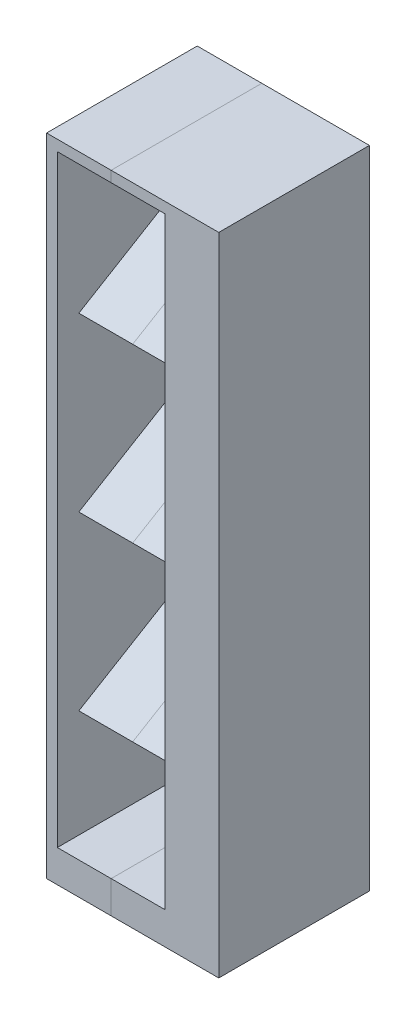
ISO-10303-21;
HEADER;
FILE_DESCRIPTION(('STEP AP214'),'2;1');
FILE_NAME('part.step','',(''),(''),'','','');
FILE_SCHEMA(('AUTOMOTIVE_DESIGN { 1 0 10303 214 1 1 1 1 }'));
ENDSEC;
DATA;
#1=APPLICATION_CONTEXT('core data for automotive mechanical design processes');
#2=APPLICATION_PROTOCOL_DEFINITION('international standard','automotive_design',2000,#1);
#3=PRODUCT_CONTEXT('',#1,'mechanical');
#4=PRODUCT('Part','Part','',(#3));
#5=PRODUCT_RELATED_PRODUCT_CATEGORY('part','',(#4));
#6=PRODUCT_DEFINITION_FORMATION('','',#4);
#7=PRODUCT_DEFINITION_CONTEXT('part definition',#1,'design');
#8=PRODUCT_DEFINITION('design','',#6,#7);
#9=PRODUCT_DEFINITION_SHAPE('','',#8);
#10=(LENGTH_UNIT() NAMED_UNIT(*) SI_UNIT(.MILLI.,.METRE.));
#11=(NAMED_UNIT(*) PLANE_ANGLE_UNIT() SI_UNIT($,.RADIAN.));
#12=(NAMED_UNIT(*) SI_UNIT($,.STERADIAN.) SOLID_ANGLE_UNIT());
#13=UNCERTAINTY_MEASURE_WITH_UNIT(LENGTH_MEASURE(1.E-05),#10,'distance_accuracy_value','');
#14=(GEOMETRIC_REPRESENTATION_CONTEXT(3) GLOBAL_UNCERTAINTY_ASSIGNED_CONTEXT((#13)) GLOBAL_UNIT_ASSIGNED_CONTEXT((#10,
#11,#12)) REPRESENTATION_CONTEXT('',''));
#15=CARTESIAN_POINT('',(0.,0.,0.));
#16=DIRECTION('',(0.,0.,1.));
#17=DIRECTION('',(1.,0.,0.));
#18=AXIS2_PLACEMENT_3D('',#15,#16,#17);
#19=CARTESIAN_POINT('',(-5.99706744868036,0.,0.));
#20=DIRECTION('',(1.,0.,0.));
#21=DIRECTION('',(0.,0.,-1.));
#22=AXIS2_PLACEMENT_3D('',#19,#20,#21);
#23=PLANE('',#22);
#24=DIRECTION('',(0.,-1.,0.));
#25=VECTOR('',#24,1.);
#26=CARTESIAN_POINT('',(-5.99706744868036,150.,24.633431085044));
#27=LINE('',#26,#25);
#28=CARTESIAN_POINT('',(-5.99706744868036,7.50000000000016,24.633431085044));
#29=VERTEX_POINT('',#28);
#30=CARTESIAN_POINT('',(-5.99706744868036,0.,24.633431085044));
#31=VERTEX_POINT('',#30);
#32=EDGE_CURVE('E255',#29,#31,#27,.T.);
#33=ORIENTED_EDGE('',*,*,#32,.T.);
#34=DIRECTION('',(0.,0.,-1.));
#35=VECTOR('',#34,1.);
#36=CARTESIAN_POINT('',(-5.99706744868036,0.,0.));
#37=LINE('',#36,#35);
#38=CARTESIAN_POINT('',(-5.99706744868036,0.,-10.366568914956));
#39=VERTEX_POINT('',#38);
#40=EDGE_CURVE('E249',#31,#39,#37,.T.);
#41=ORIENTED_EDGE('',*,*,#40,.T.);
#42=DIRECTION('',(0.,1.,0.));
#43=VECTOR('',#42,1.);
#44=CARTESIAN_POINT('',(-5.99706744868036,150.,-10.366568914956));
#45=LINE('',#44,#43);
#46=CARTESIAN_POINT('',(-5.99706744868036,150.,-10.366568914956));
#47=VERTEX_POINT('',#46);
#48=EDGE_CURVE('E252',#39,#47,#45,.T.);
#49=ORIENTED_EDGE('',*,*,#48,.T.);
#50=DIRECTION('',(0.,0.,-1.));
#51=VECTOR('',#50,1.);
#52=CARTESIAN_POINT('',(-5.99706744868036,150.,0.));
#53=LINE('',#52,#51);
#54=CARTESIAN_POINT('',(-5.99706744868036,150.,24.633431085044));
#55=VERTEX_POINT('',#54);
#56=EDGE_CURVE('E258',#55,#47,#53,.T.);
#57=ORIENTED_EDGE('',*,*,#56,.F.);
#58=CARTESIAN_POINT('',(-5.99706744868036,147.5,24.6334310850438));
#59=VERTEX_POINT('',#58);
#60=EDGE_CURVE('E257',#55,#59,#27,.T.);
#61=ORIENTED_EDGE('',*,*,#60,.T.);
#62=DIRECTION('',(0.,0.,1.));
#63=VECTOR('',#62,1.);
#64=CARTESIAN_POINT('',(-5.99706744868036,147.5,-5.36656891495616));
#65=LINE('',#64,#63);
#66=CARTESIAN_POINT('',(-5.99706744868036,147.5,-5.36656891495616));
#67=VERTEX_POINT('',#66);
#68=EDGE_CURVE('E269',#67,#59,#65,.T.);
#69=ORIENTED_EDGE('',*,*,#68,.F.);
#70=DIRECTION('',(0.,1.,0.));
#71=VECTOR('',#70,1.);
#72=CARTESIAN_POINT('',(-5.99706744868036,7.50000000000015,-5.36656891495602));
#73=LINE('',#72,#71);
#74=CARTESIAN_POINT('',(-5.99706744868035,127.5,-5.36656891495614));
#75=VERTEX_POINT('',#74);
#76=EDGE_CURVE('E239',#75,#67,#73,.T.);
#77=ORIENTED_EDGE('',*,*,#76,.F.);
#78=DIRECTION('',(0.,-0.514495755427526,0.857492925712545));
#79=VECTOR('',#78,1.);
#80=CARTESIAN_POINT('',(-5.99706744868035,112.5,19.6334310850439));
#81=LINE('',#80,#79);
#82=CARTESIAN_POINT('',(-5.99706744868035,112.5,19.6334310850439));
#83=VERTEX_POINT('',#82);
#84=EDGE_CURVE('E234',#75,#83,#81,.T.);
#85=ORIENTED_EDGE('',*,*,#84,.T.);
#86=DIRECTION('',(0.,-0.514495755427527,-0.857492925712544));
#87=VECTOR('',#86,1.);
#88=CARTESIAN_POINT('',(-5.99706744868035,97.5000000000001,-5.36656891495611));
#89=LINE('',#88,#87);
#90=CARTESIAN_POINT('',(-5.99706744868035,97.5000000000001,-5.36656891495611));
#91=VERTEX_POINT('',#90);
#92=EDGE_CURVE('E189',#83,#91,#89,.T.);
#93=ORIENTED_EDGE('',*,*,#92,.T.);
#94=DIRECTION('',(0.,1.,0.));
#95=VECTOR('',#94,1.);
#96=CARTESIAN_POINT('',(-5.99706744868036,7.50000000000015,-5.36656891495602));
#97=LINE('',#96,#95);
#98=CARTESIAN_POINT('',(-5.99706744868035,87.5000000000001,-5.3665689149561));
#99=VERTEX_POINT('',#98);
#100=EDGE_CURVE('E188',#99,#91,#97,.T.);
#101=ORIENTED_EDGE('',*,*,#100,.F.);
#102=DIRECTION('',(0.,-0.514495755427526,0.857492925712545));
#103=VECTOR('',#102,1.);
#104=CARTESIAN_POINT('',(-5.99706744868035,72.5000000000002,19.6334310850439));
#105=LINE('',#104,#103);
#106=CARTESIAN_POINT('',(-5.99706744868035,72.5000000000002,19.6334310850439));
#107=VERTEX_POINT('',#106);
#108=EDGE_CURVE('E174',#99,#107,#105,.T.);
#109=ORIENTED_EDGE('',*,*,#108,.T.);
#110=DIRECTION('',(0.,-0.514495755427527,-0.857492925712544));
#111=VECTOR('',#110,1.);
#112=CARTESIAN_POINT('',(-5.99706744868035,57.5000000000001,-5.36656891495607));
#113=LINE('',#112,#111);
#114=CARTESIAN_POINT('',(-5.99706744868035,57.5000000000001,-5.36656891495607));
#115=VERTEX_POINT('',#114);
#116=EDGE_CURVE('E185',#107,#115,#113,.T.);
#117=ORIENTED_EDGE('',*,*,#116,.T.);
#118=DIRECTION('',(0.,1.,0.));
#119=VECTOR('',#118,1.);
#120=CARTESIAN_POINT('',(-5.99706744868036,7.50000000000015,-5.36656891495602));
#121=LINE('',#120,#119);
#122=CARTESIAN_POINT('',(-5.99706744868035,47.5000000000001,-5.36656891495606));
#123=VERTEX_POINT('',#122);
#124=EDGE_CURVE('E261',#123,#115,#121,.T.);
#125=ORIENTED_EDGE('',*,*,#124,.F.);
#126=DIRECTION('',(0.,-0.514495755427526,0.857492925712545));
#127=VECTOR('',#126,1.);
#128=CARTESIAN_POINT('',(-5.99706744868035,32.5000000000002,19.633431085044));
#129=LINE('',#128,#127);
#130=CARTESIAN_POINT('',(-5.99706744868035,32.5000000000002,19.633431085044));
#131=VERTEX_POINT('',#130);
#132=EDGE_CURVE('E246',#123,#131,#129,.T.);
#133=ORIENTED_EDGE('',*,*,#132,.T.);
#134=DIRECTION('',(0.,-0.514495755427527,-0.857492925712544));
#135=VECTOR('',#134,1.);
#136=CARTESIAN_POINT('',(-5.99706744868035,17.5000000000001,-5.36656891495603));
#137=LINE('',#136,#135);
#138=CARTESIAN_POINT('',(-5.99706744868035,17.5000000000001,-5.36656891495603));
#139=VERTEX_POINT('',#138);
#140=EDGE_CURVE('E240',#131,#139,#137,.T.);
#141=ORIENTED_EDGE('',*,*,#140,.T.);
#142=DIRECTION('',(0.,1.,0.));
#143=VECTOR('',#142,1.);
#144=CARTESIAN_POINT('',(-5.99706744868036,7.50000000000015,-5.36656891495602));
#145=LINE('',#144,#143);
#146=CARTESIAN_POINT('',(-5.99706744868036,7.50000000000015,-5.36656891495602));
#147=VERTEX_POINT('',#146);
#148=EDGE_CURVE('E264',#147,#139,#145,.T.);
#149=ORIENTED_EDGE('',*,*,#148,.F.);
#150=DIRECTION('',(0.,0.,-1.));
#151=VECTOR('',#150,1.);
#152=CARTESIAN_POINT('',(-5.99706744868036,7.50000000000015,-5.36656891495602));
#153=LINE('',#152,#151);
#154=EDGE_CURVE('E267',#29,#147,#153,.T.);
#155=ORIENTED_EDGE('',*,*,#154,.F.);
#156=EDGE_LOOP('',(#33,#41,#49,#57,#61,#69,#77,#85,#93,#101,#109,#117,#125,#133,#141,#149,#155));
#157=FACE_BOUND('',#156,.T.);
#158=ADVANCED_FACE('F44',(#157),#23,.T.);
#159=CARTESIAN_POINT('',(-20.9970674486804,150.,24.633431085044));
#160=DIRECTION('',(0.,0.,-1.));
#161=DIRECTION('',(-1.,0.,0.));
#162=AXIS2_PLACEMENT_3D('',#159,#160,#161);
#163=PLANE('',#162);
#164=ORIENTED_EDGE('',*,*,#60,.F.);
#165=DIRECTION('',(1.,0.,0.));
#166=VECTOR('',#165,1.);
#167=CARTESIAN_POINT('',(-20.9970674486804,150.,24.633431085044));
#168=LINE('',#167,#166);
#169=CARTESIAN_POINT('',(-20.9970674486804,150.,24.633431085044));
#170=VERTEX_POINT('',#169);
#171=EDGE_CURVE('E197',#170,#55,#168,.T.);
#172=ORIENTED_EDGE('',*,*,#171,.F.);
#173=DIRECTION('',(0.,-1.,0.));
#174=VECTOR('',#173,1.);
#175=CARTESIAN_POINT('',(-20.9970674486804,150.,24.633431085044));
#176=LINE('',#175,#174);
#177=CARTESIAN_POINT('',(-20.9970674486804,0.,24.633431085044));
#178=VERTEX_POINT('',#177);
#179=EDGE_CURVE('E271',#170,#178,#176,.T.);
#180=ORIENTED_EDGE('',*,*,#179,.T.);
#181=DIRECTION('',(1.,0.,0.));
#182=VECTOR('',#181,1.);
#183=CARTESIAN_POINT('',(-20.9970674486804,0.,24.633431085044));
#184=LINE('',#183,#182);
#185=EDGE_CURVE('E204',#178,#31,#184,.T.);
#186=ORIENTED_EDGE('',*,*,#185,.T.);
#187=ORIENTED_EDGE('',*,*,#32,.F.);
#188=DIRECTION('',(1.,0.,0.));
#189=VECTOR('',#188,1.);
#190=CARTESIAN_POINT('',(-18.4970674486804,7.50000000000016,24.633431085044));
#191=LINE('',#190,#189);
#192=CARTESIAN_POINT('',(-18.4970674486804,7.50000000000016,24.633431085044));
#193=VERTEX_POINT('',#192);
#194=EDGE_CURVE('E210',#193,#29,#191,.T.);
#195=ORIENTED_EDGE('',*,*,#194,.F.);
#196=DIRECTION('',(0.,1.,0.));
#197=VECTOR('',#196,1.);
#198=CARTESIAN_POINT('',(-18.4970674486804,7.50000000000016,24.633431085044));
#199=LINE('',#198,#197);
#200=CARTESIAN_POINT('',(-18.4970674486804,147.5,24.6334310850438));
#201=VERTEX_POINT('',#200);
#202=EDGE_CURVE('E289',#193,#201,#199,.T.);
#203=ORIENTED_EDGE('',*,*,#202,.T.);
#204=DIRECTION('',(1.,0.,0.));
#205=VECTOR('',#204,1.);
#206=CARTESIAN_POINT('',(-18.4970674486804,147.5,24.6334310850438));
#207=LINE('',#206,#205);
#208=EDGE_CURVE('E213',#201,#59,#207,.T.);
#209=ORIENTED_EDGE('',*,*,#208,.T.);
#210=EDGE_LOOP('',(#164,#172,#180,#186,#187,#195,#203,#209));
#211=FACE_BOUND('',#210,.T.);
#212=ADVANCED_FACE('F303',(#211),#163,.F.);
#213=CARTESIAN_POINT('',(-20.9970674486804,150.,-10.366568914956));
#214=DIRECTION('',(0.,0.,1.));
#215=DIRECTION('',(1.,0.,0.));
#216=AXIS2_PLACEMENT_3D('',#213,#214,#215);
#217=PLANE('',#216);
#218=ORIENTED_EDGE('',*,*,#48,.F.);
#219=DIRECTION('',(-1.,0.,0.));
#220=VECTOR('',#219,1.);
#221=CARTESIAN_POINT('',(-20.9970674486804,0.,-10.366568914956));
#222=LINE('',#221,#220);
#223=CARTESIAN_POINT('',(-20.9970674486804,0.,-10.366568914956));
#224=VERTEX_POINT('',#223);
#225=EDGE_CURVE('E202',#39,#224,#222,.T.);
#226=ORIENTED_EDGE('',*,*,#225,.T.);
#227=DIRECTION('',(0.,-1.,0.));
#228=VECTOR('',#227,1.);
#229=CARTESIAN_POINT('',(-20.9970674486804,150.,-10.366568914956));
#230=LINE('',#229,#228);
#231=CARTESIAN_POINT('',(-20.9970674486804,150.,-10.366568914956));
#232=VERTEX_POINT('',#231);
#233=EDGE_CURVE('E198',#232,#224,#230,.T.);
#234=ORIENTED_EDGE('',*,*,#233,.F.);
#235=DIRECTION('',(-1.,0.,0.));
#236=VECTOR('',#235,1.);
#237=CARTESIAN_POINT('',(-20.9970674486804,150.,-10.366568914956));
#238=LINE('',#237,#236);
#239=EDGE_CURVE('E195',#47,#232,#238,.T.);
#240=ORIENTED_EDGE('',*,*,#239,.F.);
#241=EDGE_LOOP('',(#218,#226,#234,#240));
#242=FACE_BOUND('',#241,.T.);
#243=ADVANCED_FACE('F331',(#242),#217,.F.);
#244=CARTESIAN_POINT('',(0.,150.,0.));
#245=DIRECTION('',(0.,1.,0.));
#246=DIRECTION('',(0.,0.,1.));
#247=AXIS2_PLACEMENT_3D('',#244,#245,#246);
#248=PLANE('',#247);
#249=ORIENTED_EDGE('',*,*,#171,.T.);
#250=ORIENTED_EDGE('',*,*,#56,.T.);
#251=ORIENTED_EDGE('',*,*,#239,.T.);
#252=DIRECTION('',(0.,0.,1.));
#253=VECTOR('',#252,1.);
#254=CARTESIAN_POINT('',(-20.9970674486804,150.,-10.366568914956));
#255=LINE('',#254,#253);
#256=EDGE_CURVE('E201',#232,#170,#255,.T.);
#257=ORIENTED_EDGE('',*,*,#256,.T.);
#258=EDGE_LOOP('',(#249,#250,#251,#257));
#259=FACE_BOUND('',#258,.T.);
#260=ADVANCED_FACE('F46',(#259),#248,.T.);
#261=CARTESIAN_POINT('',(0.,0.,0.));
#262=DIRECTION('',(0.,1.,0.));
#263=DIRECTION('',(0.,0.,1.));
#264=AXIS2_PLACEMENT_3D('',#261,#262,#263);
#265=PLANE('',#264);
#266=ORIENTED_EDGE('',*,*,#40,.F.);
#267=ORIENTED_EDGE('',*,*,#185,.F.);
#268=DIRECTION('',(0.,0.,1.));
#269=VECTOR('',#268,1.);
#270=CARTESIAN_POINT('',(-20.9970674486804,0.,-10.366568914956));
#271=LINE('',#270,#269);
#272=EDGE_CURVE('E206',#224,#178,#271,.T.);
#273=ORIENTED_EDGE('',*,*,#272,.F.);
#274=ORIENTED_EDGE('',*,*,#225,.F.);
#275=EDGE_LOOP('',(#266,#267,#273,#274));
#276=FACE_BOUND('',#275,.T.);
#277=ADVANCED_FACE('F312',(#276),#265,.F.);
#278=CARTESIAN_POINT('',(-18.4970674486804,7.50000000000015,-5.36656891495602));
#279=DIRECTION('',(0.,0.,1.));
#280=DIRECTION('',(0.,1.,0.));
#281=AXIS2_PLACEMENT_3D('',#278,#279,#280);
#282=PLANE('',#281);
#283=DIRECTION('',(1.,0.,0.));
#284=VECTOR('',#283,1.);
#285=CARTESIAN_POINT('',(-57.5483158282136,87.5000000000001,-5.3665689149561));
#286=LINE('',#285,#284);
#287=CARTESIAN_POINT('',(-18.4970674486804,87.5000000000001,-5.3665689149561));
#288=VERTEX_POINT('',#287);
#289=EDGE_CURVE('E178',#288,#99,#286,.T.);
#290=ORIENTED_EDGE('',*,*,#289,.T.);
#291=ORIENTED_EDGE('',*,*,#100,.T.);
#292=DIRECTION('',(1.,0.,0.));
#293=VECTOR('',#292,1.);
#294=CARTESIAN_POINT('',(-57.5483158282136,97.5000000000001,-5.36656891495611));
#295=LINE('',#294,#293);
#296=CARTESIAN_POINT('',(-18.4970674486804,97.5000000000001,-5.36656891495611));
#297=VERTEX_POINT('',#296);
#298=EDGE_CURVE('E229',#297,#91,#295,.T.);
#299=ORIENTED_EDGE('',*,*,#298,.F.);
#300=DIRECTION('',(0.,-1.,0.));
#301=VECTOR('',#300,1.);
#302=CARTESIAN_POINT('',(-18.4970674486804,7.50000000000015,-5.36656891495602));
#303=LINE('',#302,#301);
#304=EDGE_CURVE('E285',#297,#288,#303,.T.);
#305=ORIENTED_EDGE('',*,*,#304,.T.);
#306=EDGE_LOOP('',(#290,#291,#299,#305));
#307=FACE_BOUND('',#306,.T.);
#308=ADVANCED_FACE('F342',(#307),#282,.T.);
#309=DIRECTION('',(1.,0.,0.));
#310=VECTOR('',#309,1.);
#311=CARTESIAN_POINT('',(-57.5483158282136,47.5000000000001,-5.36656891495606));
#312=LINE('',#311,#310);
#313=CARTESIAN_POINT('',(-18.4970674486804,47.5000000000001,-5.36656891495606));
#314=VERTEX_POINT('',#313);
#315=EDGE_CURVE('E225',#314,#123,#312,.T.);
#316=ORIENTED_EDGE('',*,*,#315,.T.);
#317=ORIENTED_EDGE('',*,*,#124,.T.);
#318=DIRECTION('',(1.,0.,0.));
#319=VECTOR('',#318,1.);
#320=CARTESIAN_POINT('',(-57.5483158282136,57.5000000000001,-5.36656891495607));
#321=LINE('',#320,#319);
#322=CARTESIAN_POINT('',(-18.4970674486804,57.5000000000001,-5.36656891495607));
#323=VERTEX_POINT('',#322);
#324=EDGE_CURVE('E77',#323,#115,#321,.T.);
#325=ORIENTED_EDGE('',*,*,#324,.F.);
#326=EDGE_CURVE('E287',#323,#314,#303,.T.);
#327=ORIENTED_EDGE('',*,*,#326,.T.);
#328=EDGE_LOOP('',(#316,#317,#325,#327));
#329=FACE_BOUND('',#328,.T.);
#330=ADVANCED_FACE('F345',(#329),#282,.T.);
#331=DIRECTION('',(1.,0.,0.));
#332=VECTOR('',#331,1.);
#333=CARTESIAN_POINT('',(-57.5483158282136,127.5,-5.36656891495614));
#334=LINE('',#333,#332);
#335=CARTESIAN_POINT('',(-18.4970674486804,127.5,-5.36656891495614));
#336=VERTEX_POINT('',#335);
#337=EDGE_CURVE('E12',#336,#75,#334,.T.);
#338=ORIENTED_EDGE('',*,*,#337,.T.);
#339=ORIENTED_EDGE('',*,*,#76,.T.);
#340=DIRECTION('',(1.,0.,0.));
#341=VECTOR('',#340,1.);
#342=CARTESIAN_POINT('',(-18.4970674486804,147.5,-5.36656891495616));
#343=LINE('',#342,#341);
#344=CARTESIAN_POINT('',(-18.4970674486804,147.5,-5.36656891495616));
#345=VERTEX_POINT('',#344);
#346=EDGE_CURVE('E216',#345,#67,#343,.T.);
#347=ORIENTED_EDGE('',*,*,#346,.F.);
#348=EDGE_CURVE('E282',#345,#336,#303,.T.);
#349=ORIENTED_EDGE('',*,*,#348,.T.);
#350=EDGE_LOOP('',(#338,#339,#347,#349));
#351=FACE_BOUND('',#350,.T.);
#352=ADVANCED_FACE('F382',(#351),#282,.T.);
#353=DIRECTION('',(1.,0.,0.));
#354=VECTOR('',#353,1.);
#355=CARTESIAN_POINT('',(-18.4970674486804,7.50000000000015,-5.36656891495602));
#356=LINE('',#355,#354);
#357=CARTESIAN_POINT('',(-18.4970674486804,7.50000000000015,-5.36656891495602));
#358=VERTEX_POINT('',#357);
#359=EDGE_CURVE('E207',#358,#147,#356,.T.);
#360=ORIENTED_EDGE('',*,*,#359,.T.);
#361=ORIENTED_EDGE('',*,*,#148,.T.);
#362=DIRECTION('',(1.,0.,0.));
#363=VECTOR('',#362,1.);
#364=CARTESIAN_POINT('',(-57.5483158282136,17.5000000000001,-5.36656891495603));
#365=LINE('',#364,#363);
#366=CARTESIAN_POINT('',(-18.4970674486804,17.5000000000001,-5.36656891495603));
#367=VERTEX_POINT('',#366);
#368=EDGE_CURVE('E220',#367,#139,#365,.T.);
#369=ORIENTED_EDGE('',*,*,#368,.F.);
#370=EDGE_CURVE('E279',#367,#358,#303,.T.);
#371=ORIENTED_EDGE('',*,*,#370,.T.);
#372=EDGE_LOOP('',(#360,#361,#369,#371));
#373=FACE_BOUND('',#372,.T.);
#374=ADVANCED_FACE('F347',(#373),#282,.T.);
#375=CARTESIAN_POINT('',(-18.4970674486804,7.50000000000015,-5.36656891495602));
#376=DIRECTION('',(0.,1.,0.));
#377=DIRECTION('',(0.,0.,-1.));
#378=AXIS2_PLACEMENT_3D('',#375,#376,#377);
#379=PLANE('',#378);
#380=ORIENTED_EDGE('',*,*,#194,.T.);
#381=ORIENTED_EDGE('',*,*,#154,.T.);
#382=ORIENTED_EDGE('',*,*,#359,.F.);
#383=DIRECTION('',(0.,0.,1.));
#384=VECTOR('',#383,1.);
#385=CARTESIAN_POINT('',(-18.4970674486804,7.50000000000015,-5.36656891495602));
#386=LINE('',#385,#384);
#387=EDGE_CURVE('E286',#358,#193,#386,.T.);
#388=ORIENTED_EDGE('',*,*,#387,.T.);
#389=EDGE_LOOP('',(#380,#381,#382,#388));
#390=FACE_BOUND('',#389,.T.);
#391=ADVANCED_FACE('F318',(#390),#379,.T.);
#392=CARTESIAN_POINT('',(-18.4970674486804,147.5,-5.36656891495616));
#393=DIRECTION('',(0.,-1.,0.));
#394=DIRECTION('',(0.,0.,1.));
#395=AXIS2_PLACEMENT_3D('',#392,#393,#394);
#396=PLANE('',#395);
#397=ORIENTED_EDGE('',*,*,#346,.T.);
#398=ORIENTED_EDGE('',*,*,#68,.T.);
#399=ORIENTED_EDGE('',*,*,#208,.F.);
#400=DIRECTION('',(0.,0.,-1.));
#401=VECTOR('',#400,1.);
#402=CARTESIAN_POINT('',(-18.4970674486804,147.5,-5.36656891495616));
#403=LINE('',#402,#401);
#404=EDGE_CURVE('E219',#201,#345,#403,.T.);
#405=ORIENTED_EDGE('',*,*,#404,.T.);
#406=EDGE_LOOP('',(#397,#398,#399,#405));
#407=FACE_BOUND('',#406,.T.);
#408=ADVANCED_FACE('F327',(#407),#396,.T.);
#409=CARTESIAN_POINT('',(-57.5483158282136,32.5000000000002,19.633431085044));
#410=DIRECTION('',(0.,-0.857492925712545,-0.514495755427526));
#411=DIRECTION('',(0.,-0.514495755427526,0.857492925712545));
#412=AXIS2_PLACEMENT_3D('',#409,#410,#411);
#413=PLANE('',#412);
#414=ORIENTED_EDGE('',*,*,#132,.F.);
#415=ORIENTED_EDGE('',*,*,#315,.F.);
#416=DIRECTION('',(0.,-0.514495755427526,0.857492925712545));
#417=VECTOR('',#416,1.);
#418=CARTESIAN_POINT('',(-18.4970674486804,32.5000000000002,19.633431085044));
#419=LINE('',#418,#417);
#420=CARTESIAN_POINT('',(-18.4970674486804,32.5000000000002,19.633431085044));
#421=VERTEX_POINT('',#420);
#422=EDGE_CURVE('E223',#314,#421,#419,.T.);
#423=ORIENTED_EDGE('',*,*,#422,.T.);
#424=DIRECTION('',(1.,0.,0.));
#425=VECTOR('',#424,1.);
#426=CARTESIAN_POINT('',(-57.5483158282136,32.5000000000002,19.633431085044));
#427=LINE('',#426,#425);
#428=EDGE_CURVE('E222',#421,#131,#427,.T.);
#429=ORIENTED_EDGE('',*,*,#428,.T.);
#430=EDGE_LOOP('',(#414,#415,#423,#429));
#431=FACE_BOUND('',#430,.T.);
#432=ADVANCED_FACE('F357',(#431),#413,.F.);
#433=CARTESIAN_POINT('',(-57.5483158282136,17.5000000000001,-5.36656891495603));
#434=DIRECTION('',(0.,0.857492925712544,-0.514495755427527));
#435=DIRECTION('',(0.,-0.514495755427527,-0.857492925712544));
#436=AXIS2_PLACEMENT_3D('',#433,#434,#435);
#437=PLANE('',#436);
#438=ORIENTED_EDGE('',*,*,#140,.F.);
#439=ORIENTED_EDGE('',*,*,#428,.F.);
#440=DIRECTION('',(0.,-0.514495755427527,-0.857492925712544));
#441=VECTOR('',#440,1.);
#442=CARTESIAN_POINT('',(-18.4970674486804,17.5000000000001,-5.36656891495603));
#443=LINE('',#442,#441);
#444=EDGE_CURVE('E276',#421,#367,#443,.T.);
#445=ORIENTED_EDGE('',*,*,#444,.T.);
#446=ORIENTED_EDGE('',*,*,#368,.T.);
#447=EDGE_LOOP('',(#438,#439,#445,#446));
#448=FACE_BOUND('',#447,.T.);
#449=ADVANCED_FACE('F354',(#448),#437,.F.);
#450=CARTESIAN_POINT('',(-57.5483158282136,112.5,19.6334310850439));
#451=DIRECTION('',(0.,-0.857492925712545,-0.514495755427526));
#452=DIRECTION('',(0.,-0.514495755427526,0.857492925712545));
#453=AXIS2_PLACEMENT_3D('',#450,#451,#452);
#454=PLANE('',#453);
#455=ORIENTED_EDGE('',*,*,#84,.F.);
#456=ORIENTED_EDGE('',*,*,#337,.F.);
#457=DIRECTION('',(0.,-0.514495755427526,0.857492925712545));
#458=VECTOR('',#457,1.);
#459=CARTESIAN_POINT('',(-18.4970674486804,112.5,19.6334310850439));
#460=LINE('',#459,#458);
#461=CARTESIAN_POINT('',(-18.4970674486804,112.5,19.6334310850439));
#462=VERTEX_POINT('',#461);
#463=EDGE_CURVE('E85',#336,#462,#460,.T.);
#464=ORIENTED_EDGE('',*,*,#463,.T.);
#465=DIRECTION('',(1.,0.,0.));
#466=VECTOR('',#465,1.);
#467=CARTESIAN_POINT('',(-57.5483158282136,112.5,19.6334310850439));
#468=LINE('',#467,#466);
#469=EDGE_CURVE('E53',#462,#83,#468,.T.);
#470=ORIENTED_EDGE('',*,*,#469,.T.);
#471=EDGE_LOOP('',(#455,#456,#464,#470));
#472=FACE_BOUND('',#471,.T.);
#473=ADVANCED_FACE('F233',(#472),#454,.F.);
#474=CARTESIAN_POINT('',(-57.5483158282136,97.5000000000001,-5.36656891495611));
#475=DIRECTION('',(0.,0.857492925712544,-0.514495755427527));
#476=DIRECTION('',(0.,-0.514495755427527,-0.857492925712544));
#477=AXIS2_PLACEMENT_3D('',#474,#475,#476);
#478=PLANE('',#477);
#479=ORIENTED_EDGE('',*,*,#92,.F.);
#480=ORIENTED_EDGE('',*,*,#469,.F.);
#481=DIRECTION('',(0.,-0.514495755427527,-0.857492925712544));
#482=VECTOR('',#481,1.);
#483=CARTESIAN_POINT('',(-18.4970674486804,97.5000000000001,-5.36656891495611));
#484=LINE('',#483,#482);
#485=EDGE_CURVE('E61',#462,#297,#484,.T.);
#486=ORIENTED_EDGE('',*,*,#485,.T.);
#487=ORIENTED_EDGE('',*,*,#298,.T.);
#488=EDGE_LOOP('',(#479,#480,#486,#487));
#489=FACE_BOUND('',#488,.T.);
#490=ADVANCED_FACE('F242',(#489),#478,.F.);
#491=CARTESIAN_POINT('',(-57.5483158282136,72.5000000000002,19.6334310850439));
#492=DIRECTION('',(0.,-0.857492925712545,-0.514495755427526));
#493=DIRECTION('',(0.,-0.514495755427526,0.857492925712545));
#494=AXIS2_PLACEMENT_3D('',#491,#492,#493);
#495=PLANE('',#494);
#496=ORIENTED_EDGE('',*,*,#108,.F.);
#497=ORIENTED_EDGE('',*,*,#289,.F.);
#498=DIRECTION('',(0.,-0.514495755427526,0.857492925712545));
#499=VECTOR('',#498,1.);
#500=CARTESIAN_POINT('',(-18.4970674486804,72.5000000000002,19.6334310850439));
#501=LINE('',#500,#499);
#502=CARTESIAN_POINT('',(-18.4970674486804,72.5000000000002,19.6334310850439));
#503=VERTEX_POINT('',#502);
#504=EDGE_CURVE('E175',#288,#503,#501,.T.);
#505=ORIENTED_EDGE('',*,*,#504,.T.);
#506=DIRECTION('',(1.,0.,0.));
#507=VECTOR('',#506,1.);
#508=CARTESIAN_POINT('',(-57.5483158282136,72.5000000000002,19.6334310850439));
#509=LINE('',#508,#507);
#510=EDGE_CURVE('E170',#503,#107,#509,.T.);
#511=ORIENTED_EDGE('',*,*,#510,.T.);
#512=EDGE_LOOP('',(#496,#497,#505,#511));
#513=FACE_BOUND('',#512,.T.);
#514=ADVANCED_FACE('F172',(#513),#495,.F.);
#515=CARTESIAN_POINT('',(-57.5483158282136,57.5000000000001,-5.36656891495607));
#516=DIRECTION('',(0.,0.857492925712544,-0.514495755427527));
#517=DIRECTION('',(0.,-0.514495755427527,-0.857492925712544));
#518=AXIS2_PLACEMENT_3D('',#515,#516,#517);
#519=PLANE('',#518);
#520=ORIENTED_EDGE('',*,*,#116,.F.);
#521=ORIENTED_EDGE('',*,*,#510,.F.);
#522=DIRECTION('',(0.,-0.514495755427527,-0.857492925712544));
#523=VECTOR('',#522,1.);
#524=CARTESIAN_POINT('',(-18.4970674486804,57.5000000000001,-5.36656891495607));
#525=LINE('',#524,#523);
#526=EDGE_CURVE('E81',#503,#323,#525,.T.);
#527=ORIENTED_EDGE('',*,*,#526,.T.);
#528=ORIENTED_EDGE('',*,*,#324,.T.);
#529=EDGE_LOOP('',(#520,#521,#527,#528));
#530=FACE_BOUND('',#529,.T.);
#531=ADVANCED_FACE('F191',(#530),#519,.F.);
#532=CARTESIAN_POINT('',(-20.9970674486804,150.,-10.366568914956));
#533=DIRECTION('',(1.,0.,0.));
#534=DIRECTION('',(0.,0.,-1.));
#535=AXIS2_PLACEMENT_3D('',#532,#533,#534);
#536=PLANE('',#535);
#537=ORIENTED_EDGE('',*,*,#272,.T.);
#538=ORIENTED_EDGE('',*,*,#179,.F.);
#539=ORIENTED_EDGE('',*,*,#256,.F.);
#540=ORIENTED_EDGE('',*,*,#233,.T.);
#541=EDGE_LOOP('',(#537,#538,#539,#540));
#542=FACE_BOUND('',#541,.T.);
#543=ADVANCED_FACE('F308',(#542),#536,.F.);
#544=CARTESIAN_POINT('',(-18.4970674486804,7.50000000000015,-5.36656891495602));
#545=DIRECTION('',(1.,0.,0.));
#546=DIRECTION('',(0.,1.,0.));
#547=AXIS2_PLACEMENT_3D('',#544,#545,#546);
#548=PLANE('',#547);
#549=ORIENTED_EDGE('',*,*,#504,.F.);
#550=ORIENTED_EDGE('',*,*,#304,.F.);
#551=ORIENTED_EDGE('',*,*,#485,.F.);
#552=ORIENTED_EDGE('',*,*,#463,.F.);
#553=ORIENTED_EDGE('',*,*,#348,.F.);
#554=ORIENTED_EDGE('',*,*,#404,.F.);
#555=ORIENTED_EDGE('',*,*,#202,.F.);
#556=ORIENTED_EDGE('',*,*,#387,.F.);
#557=ORIENTED_EDGE('',*,*,#370,.F.);
#558=ORIENTED_EDGE('',*,*,#444,.F.);
#559=ORIENTED_EDGE('',*,*,#422,.F.);
#560=ORIENTED_EDGE('',*,*,#326,.F.);
#561=ORIENTED_EDGE('',*,*,#526,.F.);
#562=EDGE_LOOP('',(#549,#550,#551,#552,#553,#554,#555,#556,#557,#558,#559,#560,#561));
#563=FACE_BOUND('',#562,.T.);
#564=ADVANCED_FACE('F324',(#563),#548,.T.);
#565=CLOSED_SHELL('',(#158,#212,#243,#260,#277,#308,#330,#352,#374,#391,#408,#432,#449,#473,
#490,#514,#531,#543,#564));
#566=MANIFOLD_SOLID_BREP('B2',#565);
#567=CARTESIAN_POINT('',(-5.99706744868036,0.,0.));
#568=DIRECTION('',(1.,0.,0.));
#569=DIRECTION('',(0.,0.,-1.));
#570=AXIS2_PLACEMENT_3D('',#567,#568,#569);
#571=PLANE('',#570);
#572=DIRECTION('',(0.,-1.,0.));
#573=VECTOR('',#572,1.);
#574=CARTESIAN_POINT('',(-5.99706744868036,150.,24.633431085044));
#575=LINE('',#574,#573);
#576=CARTESIAN_POINT('',(-5.99706744868036,7.50000000000016,24.633431085044));
#577=VERTEX_POINT('',#576);
#578=CARTESIAN_POINT('',(-5.99706744868036,0.,24.633431085044));
#579=VERTEX_POINT('',#578);
#580=EDGE_CURVE('E718',#577,#579,#575,.T.);
#581=ORIENTED_EDGE('',*,*,#580,.F.);
#582=DIRECTION('',(0.,0.,-1.));
#583=VECTOR('',#582,1.);
#584=CARTESIAN_POINT('',(-5.99706744868036,7.50000000000015,-5.36656891495602));
#585=LINE('',#584,#583);
#586=CARTESIAN_POINT('',(-5.99706744868036,7.50000000000015,-5.36656891495602));
#587=VERTEX_POINT('',#586);
#588=EDGE_CURVE('E506',#577,#587,#585,.T.);
#589=ORIENTED_EDGE('',*,*,#588,.T.);
#590=DIRECTION('',(0.,1.,0.));
#591=VECTOR('',#590,1.);
#592=CARTESIAN_POINT('',(-5.99706744868036,7.50000000000015,-5.36656891495602));
#593=LINE('',#592,#591);
#594=CARTESIAN_POINT('',(-5.99706744868035,17.5000000000001,-5.36656891495603));
#595=VERTEX_POINT('',#594);
#596=EDGE_CURVE('E713',#587,#595,#593,.T.);
#597=ORIENTED_EDGE('',*,*,#596,.T.);
#598=DIRECTION('',(0.,-0.514495755427527,-0.857492925712544));
#599=VECTOR('',#598,1.);
#600=CARTESIAN_POINT('',(-5.99706744868035,17.5000000000001,-5.36656891495603));
#601=LINE('',#600,#599);
#602=CARTESIAN_POINT('',(-5.99706744868035,32.5000000000002,19.633431085044));
#603=VERTEX_POINT('',#602);
#604=EDGE_CURVE('E709',#603,#595,#601,.T.);
#605=ORIENTED_EDGE('',*,*,#604,.F.);
#606=DIRECTION('',(0.,-0.514495755427526,0.857492925712545));
#607=VECTOR('',#606,1.);
#608=CARTESIAN_POINT('',(-5.99706744868035,32.5000000000002,19.633431085044));
#609=LINE('',#608,#607);
#610=CARTESIAN_POINT('',(-5.99706744868035,47.5000000000001,-5.36656891495606));
#611=VERTEX_POINT('',#610);
#612=EDGE_CURVE('E710',#611,#603,#609,.T.);
#613=ORIENTED_EDGE('',*,*,#612,.F.);
#614=DIRECTION('',(0.,1.,0.));
#615=VECTOR('',#614,1.);
#616=CARTESIAN_POINT('',(-5.99706744868036,7.50000000000015,-5.36656891495602));
#617=LINE('',#616,#615);
#618=CARTESIAN_POINT('',(-5.99706744868035,57.5000000000001,-5.36656891495607));
#619=VERTEX_POINT('',#618);
#620=EDGE_CURVE('E699',#611,#619,#617,.T.);
#621=ORIENTED_EDGE('',*,*,#620,.T.);
#622=DIRECTION('',(0.,-0.514495755427527,-0.857492925712544));
#623=VECTOR('',#622,1.);
#624=CARTESIAN_POINT('',(-5.99706744868035,57.5000000000001,-5.36656891495607));
#625=LINE('',#624,#623);
#626=CARTESIAN_POINT('',(-5.99706744868035,72.5000000000002,19.6334310850439));
#627=VERTEX_POINT('',#626);
#628=EDGE_CURVE('E623',#627,#619,#625,.T.);
#629=ORIENTED_EDGE('',*,*,#628,.F.);
#630=DIRECTION('',(0.,-0.514495755427526,0.857492925712545));
#631=VECTOR('',#630,1.);
#632=CARTESIAN_POINT('',(-5.99706744868035,72.5000000000002,19.6334310850439));
#633=LINE('',#632,#631);
#634=CARTESIAN_POINT('',(-5.99706744868035,87.5000000000001,-5.3665689149561));
#635=VERTEX_POINT('',#634);
#636=EDGE_CURVE('E696',#635,#627,#633,.T.);
#637=ORIENTED_EDGE('',*,*,#636,.F.);
#638=DIRECTION('',(0.,1.,0.));
#639=VECTOR('',#638,1.);
#640=CARTESIAN_POINT('',(-5.99706744868036,7.50000000000015,-5.36656891495602));
#641=LINE('',#640,#639);
#642=CARTESIAN_POINT('',(-5.99706744868035,97.5000000000001,-5.36656891495611));
#643=VERTEX_POINT('',#642);
#644=EDGE_CURVE('E702',#635,#643,#641,.T.);
#645=ORIENTED_EDGE('',*,*,#644,.T.);
#646=DIRECTION('',(0.,-0.514495755427527,-0.857492925712544));
#647=VECTOR('',#646,1.);
#648=CARTESIAN_POINT('',(-5.99706744868035,97.5000000000001,-5.36656891495611));
#649=LINE('',#648,#647);
#650=CARTESIAN_POINT('',(-5.99706744868035,112.5,19.6334310850439));
#651=VERTEX_POINT('',#650);
#652=EDGE_CURVE('E698',#651,#643,#649,.T.);
#653=ORIENTED_EDGE('',*,*,#652,.F.);
#654=DIRECTION('',(0.,-0.514495755427526,0.857492925712545));
#655=VECTOR('',#654,1.);
#656=CARTESIAN_POINT('',(-5.99706744868035,112.5,19.6334310850439));
#657=LINE('',#656,#655);
#658=CARTESIAN_POINT('',(-5.99706744868035,127.5,-5.36656891495614));
#659=VERTEX_POINT('',#658);
#660=EDGE_CURVE('E707',#659,#651,#657,.T.);
#661=ORIENTED_EDGE('',*,*,#660,.F.);
#662=DIRECTION('',(0.,1.,0.));
#663=VECTOR('',#662,1.);
#664=CARTESIAN_POINT('',(-5.99706744868036,7.50000000000015,-5.36656891495602));
#665=LINE('',#664,#663);
#666=CARTESIAN_POINT('',(-5.99706744868036,147.5,-5.36656891495616));
#667=VERTEX_POINT('',#666);
#668=EDGE_CURVE('E701',#659,#667,#665,.T.);
#669=ORIENTED_EDGE('',*,*,#668,.T.);
#670=DIRECTION('',(0.,0.,1.));
#671=VECTOR('',#670,1.);
#672=CARTESIAN_POINT('',(-5.99706744868036,147.5,-5.36656891495616));
#673=LINE('',#672,#671);
#674=CARTESIAN_POINT('',(-5.99706744868036,147.5,24.6334310850438));
#675=VERTEX_POINT('',#674);
#676=EDGE_CURVE('E42',#667,#675,#673,.T.);
#677=ORIENTED_EDGE('',*,*,#676,.T.);
#678=CARTESIAN_POINT('',(-5.99706744868036,150.,24.633431085044));
#679=VERTEX_POINT('',#678);
#680=EDGE_CURVE('E514',#679,#675,#575,.T.);
#681=ORIENTED_EDGE('',*,*,#680,.F.);
#682=DIRECTION('',(0.,0.,-1.));
#683=VECTOR('',#682,1.);
#684=CARTESIAN_POINT('',(-5.99706744868036,150.,0.));
#685=LINE('',#684,#683);
#686=CARTESIAN_POINT('',(-5.99706744868036,150.,-10.366568914956));
#687=VERTEX_POINT('',#686);
#688=EDGE_CURVE('E705',#679,#687,#685,.T.);
#689=ORIENTED_EDGE('',*,*,#688,.T.);
#690=DIRECTION('',(0.,1.,0.));
#691=VECTOR('',#690,1.);
#692=CARTESIAN_POINT('',(-5.99706744868036,150.,-10.366568914956));
#693=LINE('',#692,#691);
#694=CARTESIAN_POINT('',(-5.99706744868036,0.,-10.366568914956));
#695=VERTEX_POINT('',#694);
#696=EDGE_CURVE('E722',#695,#687,#693,.T.);
#697=ORIENTED_EDGE('',*,*,#696,.F.);
#698=DIRECTION('',(0.,0.,-1.));
#699=VECTOR('',#698,1.);
#700=CARTESIAN_POINT('',(-5.99706744868036,0.,0.));
#701=LINE('',#700,#699);
#702=EDGE_CURVE('E501',#579,#695,#701,.T.);
#703=ORIENTED_EDGE('',*,*,#702,.F.);
#704=EDGE_LOOP('',(#581,#589,#597,#605,#613,#621,#629,#637,#645,#653,#661,#669,#677,#681,#689,
#697,#703));
#705=FACE_BOUND('',#704,.T.);
#706=ADVANCED_FACE('F498',(#705),#571,.F.);
#707=CARTESIAN_POINT('',(19.0029325513196,150.,-10.366568914956));
#708=DIRECTION('',(-1.,0.,0.));
#709=DIRECTION('',(0.,0.,1.));
#710=AXIS2_PLACEMENT_3D('',#707,#708,#709);
#711=PLANE('',#710);
#712=DIRECTION('',(0.,0.,-1.));
#713=VECTOR('',#712,1.);
#714=CARTESIAN_POINT('',(19.0029325513196,0.,-10.366568914956));
#715=LINE('',#714,#713);
#716=CARTESIAN_POINT('',(19.0029325513197,0.,24.633431085044));
#717=VERTEX_POINT('',#716);
#718=CARTESIAN_POINT('',(19.0029325513196,0.,-10.366568914956));
#719=VERTEX_POINT('',#718);
#720=EDGE_CURVE('E686',#717,#719,#715,.T.);
#721=ORIENTED_EDGE('',*,*,#720,.T.);
#722=DIRECTION('',(0.,-1.,0.));
#723=VECTOR('',#722,1.);
#724=CARTESIAN_POINT('',(19.0029325513196,150.,-10.366568914956));
#725=LINE('',#724,#723);
#726=CARTESIAN_POINT('',(19.0029325513196,150.,-10.366568914956));
#727=VERTEX_POINT('',#726);
#728=EDGE_CURVE('E684',#727,#719,#725,.T.);
#729=ORIENTED_EDGE('',*,*,#728,.F.);
#730=DIRECTION('',(0.,0.,-1.));
#731=VECTOR('',#730,1.);
#732=CARTESIAN_POINT('',(19.0029325513196,150.,-10.366568914956));
#733=LINE('',#732,#731);
#734=CARTESIAN_POINT('',(19.0029325513197,150.,24.633431085044));
#735=VERTEX_POINT('',#734);
#736=EDGE_CURVE('E678',#735,#727,#733,.T.);
#737=ORIENTED_EDGE('',*,*,#736,.F.);
#738=DIRECTION('',(0.,-1.,0.));
#739=VECTOR('',#738,1.);
#740=CARTESIAN_POINT('',(19.0029325513197,150.,24.633431085044));
#741=LINE('',#740,#739);
#742=EDGE_CURVE('E692',#735,#717,#741,.T.);
#743=ORIENTED_EDGE('',*,*,#742,.T.);
#744=EDGE_LOOP('',(#721,#729,#737,#743));
#745=FACE_BOUND('',#744,.T.);
#746=ADVANCED_FACE('F738',(#745),#711,.F.);
#747=CARTESIAN_POINT('',(-20.9970674486804,150.,-10.366568914956));
#748=DIRECTION('',(0.,0.,1.));
#749=DIRECTION('',(1.,0.,0.));
#750=AXIS2_PLACEMENT_3D('',#747,#748,#749);
#751=PLANE('',#750);
#752=DIRECTION('',(-1.,0.,0.));
#753=VECTOR('',#752,1.);
#754=CARTESIAN_POINT('',(-20.9970674486804,0.,-10.366568914956));
#755=LINE('',#754,#753);
#756=EDGE_CURVE('E679',#719,#695,#755,.T.);
#757=ORIENTED_EDGE('',*,*,#756,.T.);
#758=ORIENTED_EDGE('',*,*,#696,.T.);
#759=DIRECTION('',(-1.,0.,0.));
#760=VECTOR('',#759,1.);
#761=CARTESIAN_POINT('',(-20.9970674486804,150.,-10.366568914956));
#762=LINE('',#761,#760);
#763=EDGE_CURVE('E681',#727,#687,#762,.T.);
#764=ORIENTED_EDGE('',*,*,#763,.F.);
#765=ORIENTED_EDGE('',*,*,#728,.T.);
#766=EDGE_LOOP('',(#757,#758,#764,#765));
#767=FACE_BOUND('',#766,.T.);
#768=ADVANCED_FACE('F734',(#767),#751,.F.);
#769=CARTESIAN_POINT('',(-20.9970674486804,150.,24.633431085044));
#770=DIRECTION('',(0.,0.,-1.));
#771=DIRECTION('',(-1.,0.,0.));
#772=AXIS2_PLACEMENT_3D('',#769,#770,#771);
#773=PLANE('',#772);
#774=DIRECTION('',(1.,0.,0.));
#775=VECTOR('',#774,1.);
#776=CARTESIAN_POINT('',(-20.9970674486804,150.,24.633431085044));
#777=LINE('',#776,#775);
#778=EDGE_CURVE('E676',#679,#735,#777,.T.);
#779=ORIENTED_EDGE('',*,*,#778,.F.);
#780=ORIENTED_EDGE('',*,*,#680,.T.);
#781=DIRECTION('',(1.,0.,0.));
#782=VECTOR('',#781,1.);
#783=CARTESIAN_POINT('',(-18.4970674486804,147.5,24.6334310850438));
#784=LINE('',#783,#782);
#785=CARTESIAN_POINT('',(6.50293255131965,147.5,24.633431085044));
#786=VERTEX_POINT('',#785);
#787=EDGE_CURVE('E669',#675,#786,#784,.T.);
#788=ORIENTED_EDGE('',*,*,#787,.T.);
#789=DIRECTION('',(0.,1.,0.));
#790=VECTOR('',#789,1.);
#791=CARTESIAN_POINT('',(6.50293255131965,7.50000000000016,24.633431085044));
#792=LINE('',#791,#790);
#793=CARTESIAN_POINT('',(6.50293255131965,7.50000000000016,24.633431085044));
#794=VERTEX_POINT('',#793);
#795=EDGE_CURVE('E659',#794,#786,#792,.T.);
#796=ORIENTED_EDGE('',*,*,#795,.F.);
#797=DIRECTION('',(1.,0.,0.));
#798=VECTOR('',#797,1.);
#799=CARTESIAN_POINT('',(-18.4970674486804,7.50000000000016,24.633431085044));
#800=LINE('',#799,#798);
#801=EDGE_CURVE('E671',#577,#794,#800,.T.);
#802=ORIENTED_EDGE('',*,*,#801,.F.);
#803=ORIENTED_EDGE('',*,*,#580,.T.);
#804=DIRECTION('',(1.,0.,0.));
#805=VECTOR('',#804,1.);
#806=CARTESIAN_POINT('',(-20.9970674486804,0.,24.633431085044));
#807=LINE('',#806,#805);
#808=EDGE_CURVE('E675',#579,#717,#807,.T.);
#809=ORIENTED_EDGE('',*,*,#808,.T.);
#810=ORIENTED_EDGE('',*,*,#742,.F.);
#811=EDGE_LOOP('',(#779,#780,#788,#796,#802,#803,#809,#810));
#812=FACE_BOUND('',#811,.T.);
#813=ADVANCED_FACE('F740',(#812),#773,.F.);
#814=CARTESIAN_POINT('',(-18.4970674486804,7.50000000000015,-5.36656891495602));
#815=DIRECTION('',(0.,0.,1.));
#816=DIRECTION('',(0.,1.,0.));
#817=AXIS2_PLACEMENT_3D('',#814,#815,#816);
#818=PLANE('',#817);
#819=ORIENTED_EDGE('',*,*,#668,.F.);
#820=DIRECTION('',(1.,0.,0.));
#821=VECTOR('',#820,1.);
#822=CARTESIAN_POINT('',(-57.5483158282136,127.5,-5.36656891495614));
#823=LINE('',#822,#821);
#824=CARTESIAN_POINT('',(6.50293255131965,127.5,-5.36656891495614));
#825=VERTEX_POINT('',#824);
#826=EDGE_CURVE('E928',#659,#825,#823,.T.);
#827=ORIENTED_EDGE('',*,*,#826,.T.);
#828=DIRECTION('',(0.,-1.,0.));
#829=VECTOR('',#828,1.);
#830=CARTESIAN_POINT('',(6.50293255131965,7.50000000000015,-5.36656891495602));
#831=LINE('',#830,#829);
#832=CARTESIAN_POINT('',(6.50293255131965,147.5,-5.36656891495616));
#833=VERTEX_POINT('',#832);
#834=EDGE_CURVE('E648',#833,#825,#831,.T.);
#835=ORIENTED_EDGE('',*,*,#834,.F.);
#836=DIRECTION('',(1.,0.,0.));
#837=VECTOR('',#836,1.);
#838=CARTESIAN_POINT('',(-18.4970674486804,147.5,-5.36656891495616));
#839=LINE('',#838,#837);
#840=EDGE_CURVE('E667',#667,#833,#839,.T.);
#841=ORIENTED_EDGE('',*,*,#840,.F.);
#842=EDGE_LOOP('',(#819,#827,#835,#841));
#843=FACE_BOUND('',#842,.T.);
#844=ADVANCED_FACE('F777',(#843),#818,.T.);
#845=ORIENTED_EDGE('',*,*,#644,.F.);
#846=DIRECTION('',(1.,0.,0.));
#847=VECTOR('',#846,1.);
#848=CARTESIAN_POINT('',(-57.5483158282136,87.5000000000001,-5.3665689149561));
#849=LINE('',#848,#847);
#850=CARTESIAN_POINT('',(6.50293255131965,87.5000000000001,-5.3665689149561));
#851=VERTEX_POINT('',#850);
#852=EDGE_CURVE('E935',#635,#851,#849,.T.);
#853=ORIENTED_EDGE('',*,*,#852,.T.);
#854=CARTESIAN_POINT('',(6.50293255131965,97.5000000000001,-5.36656891495611));
#855=VERTEX_POINT('',#854);
#856=EDGE_CURVE('E645',#855,#851,#831,.T.);
#857=ORIENTED_EDGE('',*,*,#856,.F.);
#858=DIRECTION('',(1.,0.,0.));
#859=VECTOR('',#858,1.);
#860=CARTESIAN_POINT('',(-57.5483158282136,97.5000000000001,-5.36656891495611));
#861=LINE('',#860,#859);
#862=EDGE_CURVE('E640',#643,#855,#861,.T.);
#863=ORIENTED_EDGE('',*,*,#862,.F.);
#864=EDGE_LOOP('',(#845,#853,#857,#863));
#865=FACE_BOUND('',#864,.T.);
#866=ADVANCED_FACE('F776',(#865),#818,.T.);
#867=CARTESIAN_POINT('',(6.50293255131965,7.50000000000015,-5.36656891495602));
#868=DIRECTION('',(1.,0.,0.));
#869=DIRECTION('',(0.,1.,0.));
#870=AXIS2_PLACEMENT_3D('',#867,#868,#869);
#871=PLANE('',#870);
#872=DIRECTION('',(0.,0.514495755427527,0.857492925712544));
#873=VECTOR('',#872,1.);
#874=CARTESIAN_POINT('',(6.50293255131965,57.5000000000001,-5.36656891495607));
#875=LINE('',#874,#873);
#876=CARTESIAN_POINT('',(6.50293255131965,57.5000000000001,-5.36656891495607));
#877=VERTEX_POINT('',#876);
#878=CARTESIAN_POINT('',(6.50293255131965,72.5000000000002,19.6334310850439));
#879=VERTEX_POINT('',#878);
#880=EDGE_CURVE('E621',#877,#879,#875,.T.);
#881=ORIENTED_EDGE('',*,*,#880,.F.);
#882=CARTESIAN_POINT('',(6.50293255131965,47.5000000000001,-5.36656891495606));
#883=VERTEX_POINT('',#882);
#884=EDGE_CURVE('E635',#877,#883,#831,.T.);
#885=ORIENTED_EDGE('',*,*,#884,.T.);
#886=DIRECTION('',(0.,0.514495755427526,-0.857492925712545));
#887=VECTOR('',#886,1.);
#888=CARTESIAN_POINT('',(6.50293255131965,32.5000000000002,19.633431085044));
#889=LINE('',#888,#887);
#890=CARTESIAN_POINT('',(6.50293255131965,32.5000000000002,19.633431085044));
#891=VERTEX_POINT('',#890);
#892=EDGE_CURVE('E752',#891,#883,#889,.T.);
#893=ORIENTED_EDGE('',*,*,#892,.F.);
#894=DIRECTION('',(0.,0.514495755427527,0.857492925712544));
#895=VECTOR('',#894,1.);
#896=CARTESIAN_POINT('',(6.50293255131965,17.5000000000001,-5.36656891495603));
#897=LINE('',#896,#895);
#898=CARTESIAN_POINT('',(6.50293255131965,17.5000000000001,-5.36656891495603));
#899=VERTEX_POINT('',#898);
#900=EDGE_CURVE('E627',#899,#891,#897,.T.);
#901=ORIENTED_EDGE('',*,*,#900,.F.);
#902=CARTESIAN_POINT('',(6.50293255131965,7.50000000000015,-5.36656891495602));
#903=VERTEX_POINT('',#902);
#904=EDGE_CURVE('E646',#899,#903,#831,.T.);
#905=ORIENTED_EDGE('',*,*,#904,.T.);
#906=DIRECTION('',(0.,0.,1.));
#907=VECTOR('',#906,1.);
#908=CARTESIAN_POINT('',(6.50293255131965,7.50000000000015,-5.36656891495602));
#909=LINE('',#908,#907);
#910=EDGE_CURVE('E654',#903,#794,#909,.T.);
#911=ORIENTED_EDGE('',*,*,#910,.T.);
#912=ORIENTED_EDGE('',*,*,#795,.T.);
#913=DIRECTION('',(0.,0.,-1.));
#914=VECTOR('',#913,1.);
#915=CARTESIAN_POINT('',(6.50293255131965,147.5,-5.36656891495616));
#916=LINE('',#915,#914);
#917=EDGE_CURVE('E663',#786,#833,#916,.T.);
#918=ORIENTED_EDGE('',*,*,#917,.T.);
#919=ORIENTED_EDGE('',*,*,#834,.T.);
#920=DIRECTION('',(0.,0.514495755427526,-0.857492925712545));
#921=VECTOR('',#920,1.);
#922=CARTESIAN_POINT('',(6.50293255131965,112.5,19.6334310850439));
#923=LINE('',#922,#921);
#924=CARTESIAN_POINT('',(6.50293255131965,112.5,19.6334310850439));
#925=VERTEX_POINT('',#924);
#926=EDGE_CURVE('E929',#925,#825,#923,.T.);
#927=ORIENTED_EDGE('',*,*,#926,.F.);
#928=DIRECTION('',(0.,0.514495755427527,0.857492925712544));
#929=VECTOR('',#928,1.);
#930=CARTESIAN_POINT('',(6.50293255131965,97.5000000000001,-5.36656891495611));
#931=LINE('',#930,#929);
#932=EDGE_CURVE('E926',#855,#925,#931,.T.);
#933=ORIENTED_EDGE('',*,*,#932,.F.);
#934=ORIENTED_EDGE('',*,*,#856,.T.);
#935=DIRECTION('',(0.,0.514495755427526,-0.857492925712545));
#936=VECTOR('',#935,1.);
#937=CARTESIAN_POINT('',(6.50293255131965,72.5000000000002,19.6334310850439));
#938=LINE('',#937,#936);
#939=EDGE_CURVE('E639',#879,#851,#938,.T.);
#940=ORIENTED_EDGE('',*,*,#939,.F.);
#941=EDGE_LOOP('',(#881,#885,#893,#901,#905,#911,#912,#918,#919,#927,#933,#934,#940));
#942=FACE_BOUND('',#941,.T.);
#943=ADVANCED_FACE('F633',(#942),#871,.F.);
#944=ORIENTED_EDGE('',*,*,#620,.F.);
#945=DIRECTION('',(1.,0.,0.));
#946=VECTOR('',#945,1.);
#947=CARTESIAN_POINT('',(-57.5483158282136,47.5000000000001,-5.36656891495606));
#948=LINE('',#947,#946);
#949=EDGE_CURVE('E644',#611,#883,#948,.T.);
#950=ORIENTED_EDGE('',*,*,#949,.T.);
#951=ORIENTED_EDGE('',*,*,#884,.F.);
#952=DIRECTION('',(1.,0.,0.));
#953=VECTOR('',#952,1.);
#954=CARTESIAN_POINT('',(-57.5483158282136,57.5000000000001,-5.36656891495607));
#955=LINE('',#954,#953);
#956=EDGE_CURVE('E617',#619,#877,#955,.T.);
#957=ORIENTED_EDGE('',*,*,#956,.F.);
#958=EDGE_LOOP('',(#944,#950,#951,#957));
#959=FACE_BOUND('',#958,.T.);
#960=ADVANCED_FACE('F642',(#959),#818,.T.);
#961=CARTESIAN_POINT('',(-57.5483158282136,72.5000000000002,19.6334310850439));
#962=DIRECTION('',(0.,-0.857492925712545,-0.514495755427526));
#963=DIRECTION('',(0.,-0.514495755427526,0.857492925712545));
#964=AXIS2_PLACEMENT_3D('',#961,#962,#963);
#965=PLANE('',#964);
#966=ORIENTED_EDGE('',*,*,#852,.F.);
#967=ORIENTED_EDGE('',*,*,#636,.T.);
#968=DIRECTION('',(1.,0.,0.));
#969=VECTOR('',#968,1.);
#970=CARTESIAN_POINT('',(-57.5483158282136,72.5000000000002,19.6334310850439));
#971=LINE('',#970,#969);
#972=EDGE_CURVE('E628',#627,#879,#971,.T.);
#973=ORIENTED_EDGE('',*,*,#972,.T.);
#974=ORIENTED_EDGE('',*,*,#939,.T.);
#975=EDGE_LOOP('',(#966,#967,#973,#974));
#976=FACE_BOUND('',#975,.T.);
#977=ADVANCED_FACE('F805',(#976),#965,.F.);
#978=CARTESIAN_POINT('',(-57.5483158282136,57.5000000000001,-5.36656891495607));
#979=DIRECTION('',(0.,0.857492925712544,-0.514495755427527));
#980=DIRECTION('',(0.,-0.514495755427527,-0.857492925712544));
#981=AXIS2_PLACEMENT_3D('',#978,#979,#980);
#982=PLANE('',#981);
#983=ORIENTED_EDGE('',*,*,#972,.F.);
#984=ORIENTED_EDGE('',*,*,#628,.T.);
#985=ORIENTED_EDGE('',*,*,#956,.T.);
#986=ORIENTED_EDGE('',*,*,#880,.T.);
#987=EDGE_LOOP('',(#983,#984,#985,#986));
#988=FACE_BOUND('',#987,.T.);
#989=ADVANCED_FACE('F620',(#988),#982,.F.);
#990=CARTESIAN_POINT('',(-57.5483158282136,112.5,19.6334310850439));
#991=DIRECTION('',(0.,-0.857492925712545,-0.514495755427526));
#992=DIRECTION('',(0.,-0.514495755427526,0.857492925712545));
#993=AXIS2_PLACEMENT_3D('',#990,#991,#992);
#994=PLANE('',#993);
#995=ORIENTED_EDGE('',*,*,#826,.F.);
#996=ORIENTED_EDGE('',*,*,#660,.T.);
#997=DIRECTION('',(1.,0.,0.));
#998=VECTOR('',#997,1.);
#999=CARTESIAN_POINT('',(-57.5483158282136,112.5,19.6334310850439));
#1000=LINE('',#999,#998);
#1001=EDGE_CURVE('E923',#651,#925,#1000,.T.);
#1002=ORIENTED_EDGE('',*,*,#1001,.T.);
#1003=ORIENTED_EDGE('',*,*,#926,.T.);
#1004=EDGE_LOOP('',(#995,#996,#1002,#1003));
#1005=FACE_BOUND('',#1004,.T.);
#1006=ADVANCED_FACE('F893',(#1005),#994,.F.);
#1007=CARTESIAN_POINT('',(-57.5483158282136,97.5000000000001,-5.36656891495611));
#1008=DIRECTION('',(0.,0.857492925712544,-0.514495755427527));
#1009=DIRECTION('',(0.,-0.514495755427527,-0.857492925712544));
#1010=AXIS2_PLACEMENT_3D('',#1007,#1008,#1009);
#1011=PLANE('',#1010);
#1012=ORIENTED_EDGE('',*,*,#1001,.F.);
#1013=ORIENTED_EDGE('',*,*,#652,.T.);
#1014=ORIENTED_EDGE('',*,*,#862,.T.);
#1015=ORIENTED_EDGE('',*,*,#932,.T.);
#1016=EDGE_LOOP('',(#1012,#1013,#1014,#1015));
#1017=FACE_BOUND('',#1016,.T.);
#1018=ADVANCED_FACE('F774',(#1017),#1011,.F.);
#1019=ORIENTED_EDGE('',*,*,#596,.F.);
#1020=DIRECTION('',(1.,0.,0.));
#1021=VECTOR('',#1020,1.);
#1022=CARTESIAN_POINT('',(-18.4970674486804,7.50000000000015,-5.36656891495602));
#1023=LINE('',#1022,#1021);
#1024=EDGE_CURVE('E673',#587,#903,#1023,.T.);
#1025=ORIENTED_EDGE('',*,*,#1024,.T.);
#1026=ORIENTED_EDGE('',*,*,#904,.F.);
#1027=DIRECTION('',(1.,0.,0.));
#1028=VECTOR('',#1027,1.);
#1029=CARTESIAN_POINT('',(-57.5483158282136,17.5000000000001,-5.36656891495603));
#1030=LINE('',#1029,#1028);
#1031=EDGE_CURVE('E650',#595,#899,#1030,.T.);
#1032=ORIENTED_EDGE('',*,*,#1031,.F.);
#1033=EDGE_LOOP('',(#1019,#1025,#1026,#1032));
#1034=FACE_BOUND('',#1033,.T.);
#1035=ADVANCED_FACE('F749',(#1034),#818,.T.);
#1036=CARTESIAN_POINT('',(-57.5483158282136,32.5000000000002,19.633431085044));
#1037=DIRECTION('',(0.,-0.857492925712545,-0.514495755427526));
#1038=DIRECTION('',(0.,-0.514495755427526,0.857492925712545));
#1039=AXIS2_PLACEMENT_3D('',#1036,#1037,#1038);
#1040=PLANE('',#1039);
#1041=ORIENTED_EDGE('',*,*,#949,.F.);
#1042=ORIENTED_EDGE('',*,*,#612,.T.);
#1043=DIRECTION('',(1.,0.,0.));
#1044=VECTOR('',#1043,1.);
#1045=CARTESIAN_POINT('',(-57.5483158282136,32.5000000000002,19.633431085044));
#1046=LINE('',#1045,#1044);
#1047=EDGE_CURVE('E761',#603,#891,#1046,.T.);
#1048=ORIENTED_EDGE('',*,*,#1047,.T.);
#1049=ORIENTED_EDGE('',*,*,#892,.T.);
#1050=EDGE_LOOP('',(#1041,#1042,#1048,#1049));
#1051=FACE_BOUND('',#1050,.T.);
#1052=ADVANCED_FACE('F765',(#1051),#1040,.F.);
#1053=CARTESIAN_POINT('',(-57.5483158282136,17.5000000000001,-5.36656891495603));
#1054=DIRECTION('',(0.,0.857492925712544,-0.514495755427527));
#1055=DIRECTION('',(0.,-0.514495755427527,-0.857492925712544));
#1056=AXIS2_PLACEMENT_3D('',#1053,#1054,#1055);
#1057=PLANE('',#1056);
#1058=ORIENTED_EDGE('',*,*,#1047,.F.);
#1059=ORIENTED_EDGE('',*,*,#604,.T.);
#1060=ORIENTED_EDGE('',*,*,#1031,.T.);
#1061=ORIENTED_EDGE('',*,*,#900,.T.);
#1062=EDGE_LOOP('',(#1058,#1059,#1060,#1061));
#1063=FACE_BOUND('',#1062,.T.);
#1064=ADVANCED_FACE('F762',(#1063),#1057,.F.);
#1065=CARTESIAN_POINT('',(-18.4970674486804,147.5,-5.36656891495616));
#1066=DIRECTION('',(0.,-1.,0.));
#1067=DIRECTION('',(0.,0.,1.));
#1068=AXIS2_PLACEMENT_3D('',#1065,#1066,#1067);
#1069=PLANE('',#1068);
#1070=ORIENTED_EDGE('',*,*,#676,.F.);
#1071=ORIENTED_EDGE('',*,*,#840,.T.);
#1072=ORIENTED_EDGE('',*,*,#917,.F.);
#1073=ORIENTED_EDGE('',*,*,#787,.F.);
#1074=EDGE_LOOP('',(#1070,#1071,#1072,#1073));
#1075=FACE_BOUND('',#1074,.T.);
#1076=ADVANCED_FACE('F772',(#1075),#1069,.T.);
#1077=CARTESIAN_POINT('',(-18.4970674486804,7.50000000000015,-5.36656891495602));
#1078=DIRECTION('',(0.,1.,0.));
#1079=DIRECTION('',(0.,0.,-1.));
#1080=AXIS2_PLACEMENT_3D('',#1077,#1078,#1079);
#1081=PLANE('',#1080);
#1082=ORIENTED_EDGE('',*,*,#588,.F.);
#1083=ORIENTED_EDGE('',*,*,#801,.T.);
#1084=ORIENTED_EDGE('',*,*,#910,.F.);
#1085=ORIENTED_EDGE('',*,*,#1024,.F.);
#1086=EDGE_LOOP('',(#1082,#1083,#1084,#1085));
#1087=FACE_BOUND('',#1086,.T.);
#1088=ADVANCED_FACE('F746',(#1087),#1081,.T.);
#1089=CARTESIAN_POINT('',(0.,0.,0.));
#1090=DIRECTION('',(0.,1.,0.));
#1091=DIRECTION('',(0.,0.,1.));
#1092=AXIS2_PLACEMENT_3D('',#1089,#1090,#1091);
#1093=PLANE('',#1092);
#1094=ORIENTED_EDGE('',*,*,#808,.F.);
#1095=ORIENTED_EDGE('',*,*,#702,.T.);
#1096=ORIENTED_EDGE('',*,*,#756,.F.);
#1097=ORIENTED_EDGE('',*,*,#720,.F.);
#1098=EDGE_LOOP('',(#1094,#1095,#1096,#1097));
#1099=FACE_BOUND('',#1098,.T.);
#1100=ADVANCED_FACE('F730',(#1099),#1093,.F.);
#1101=CARTESIAN_POINT('',(0.,150.,0.));
#1102=DIRECTION('',(0.,1.,0.));
#1103=DIRECTION('',(0.,0.,1.));
#1104=AXIS2_PLACEMENT_3D('',#1101,#1102,#1103);
#1105=PLANE('',#1104);
#1106=ORIENTED_EDGE('',*,*,#688,.F.);
#1107=ORIENTED_EDGE('',*,*,#778,.T.);
#1108=ORIENTED_EDGE('',*,*,#736,.T.);
#1109=ORIENTED_EDGE('',*,*,#763,.T.);
#1110=EDGE_LOOP('',(#1106,#1107,#1108,#1109));
#1111=FACE_BOUND('',#1110,.T.);
#1112=ADVANCED_FACE('F780',(#1111),#1105,.T.);
#1113=CLOSED_SHELL('',(#706,#746,#768,#813,#844,#866,#943,#960,#977,#989,#1006,#1018,#1035,
#1052,#1064,#1076,#1088,#1100,#1112));
#1114=MANIFOLD_SOLID_BREP('B6',#1113);
#1115=ADVANCED_BREP_SHAPE_REPRESENTATION('',(#18,#566,#1114),#14);
#1116=SHAPE_DEFINITION_REPRESENTATION(#9,#1115);
ENDSEC;
END-ISO-10303-21;
